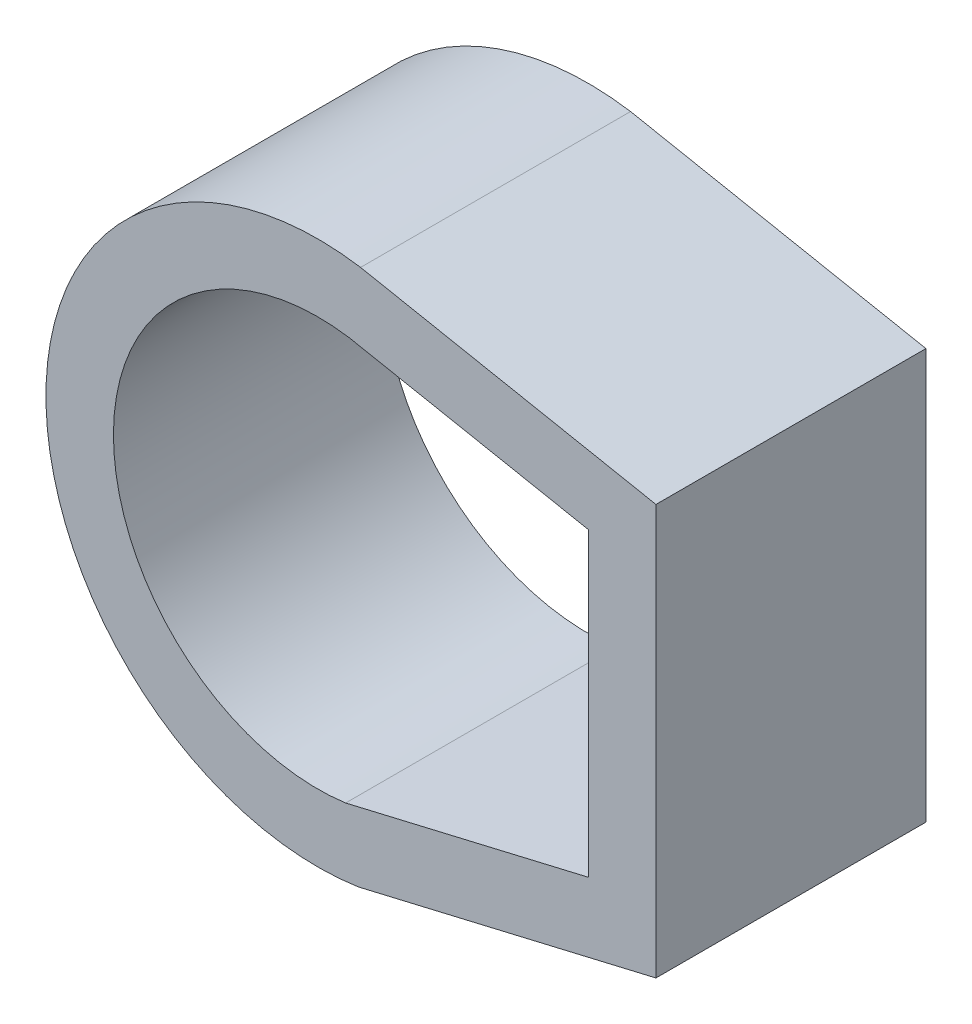
ISO-10303-21;
HEADER;
FILE_DESCRIPTION(('STEP AP214'),'2;1');
FILE_NAME('part.step','',(''),(''),'','','');
FILE_SCHEMA(('AUTOMOTIVE_DESIGN { 1 0 10303 214 1 1 1 1 }'));
ENDSEC;
DATA;
#1=APPLICATION_CONTEXT('core data for automotive mechanical design processes');
#2=APPLICATION_PROTOCOL_DEFINITION('international standard','automotive_design',2000,#1);
#3=PRODUCT_CONTEXT('',#1,'mechanical');
#4=PRODUCT('Part','Part','',(#3));
#5=PRODUCT_RELATED_PRODUCT_CATEGORY('part','',(#4));
#6=PRODUCT_DEFINITION_FORMATION('','',#4);
#7=PRODUCT_DEFINITION_CONTEXT('part definition',#1,'design');
#8=PRODUCT_DEFINITION('design','',#6,#7);
#9=PRODUCT_DEFINITION_SHAPE('','',#8);
#10=(LENGTH_UNIT() NAMED_UNIT(*) SI_UNIT(.MILLI.,.METRE.));
#11=(NAMED_UNIT(*) PLANE_ANGLE_UNIT() SI_UNIT($,.RADIAN.));
#12=(NAMED_UNIT(*) SI_UNIT($,.STERADIAN.) SOLID_ANGLE_UNIT());
#13=UNCERTAINTY_MEASURE_WITH_UNIT(LENGTH_MEASURE(1.E-05),#10,'distance_accuracy_value','');
#14=(GEOMETRIC_REPRESENTATION_CONTEXT(3) GLOBAL_UNCERTAINTY_ASSIGNED_CONTEXT((#13)) GLOBAL_UNIT_ASSIGNED_CONTEXT((#10,
#11,#12)) REPRESENTATION_CONTEXT('',''));
#15=CARTESIAN_POINT('',(0.,0.,0.));
#16=DIRECTION('',(0.,0.,1.));
#17=DIRECTION('',(1.,0.,0.));
#18=AXIS2_PLACEMENT_3D('',#15,#16,#17);
#19=CARTESIAN_POINT('',(-29.1957078004872,-9.51907763082023,20.));
#20=DIRECTION('',(0.,0.,-1.));
#21=DIRECTION('',(-1.,0.,0.));
#22=AXIS2_PLACEMENT_3D('',#19,#20,#21);
#23=PLANE('',#22);
#24=CARTESIAN_POINT('',(-29.1957078004872,-9.51907763082023,20.));
#25=DIRECTION('',(0.,0.,1.));
#26=DIRECTION('',(-1.,0.,0.));
#27=AXIS2_PLACEMENT_3D('',#24,#25,#26);
#28=CIRCLE('',#27,20.1500000000001);
#29=CARTESIAN_POINT('',(-26.0388696983067,10.3821000528403,20.));
#30=VERTEX_POINT('',#29);
#31=CARTESIAN_POINT('',(-26.215773458125,-29.4475118722555,20.));
#32=VERTEX_POINT('',#31);
#33=EDGE_CURVE('E153',#30,#32,#28,.T.);
#34=ORIENTED_EDGE('',*,*,#33,.T.);
#35=DIRECTION('',(0.973483979447677,0.228755200506381,0.));
#36=VECTOR('',#35,1.);
#37=CARTESIAN_POINT('',(-4.15724724872229,-24.2640648998974,20.));
#38=LINE('',#37,#36);
#39=CARTESIAN_POINT('',(-4.15724724872229,-24.2640648998974,20.));
#40=VERTEX_POINT('',#39);
#41=EDGE_CURVE('E157',#32,#40,#38,.T.);
#42=ORIENTED_EDGE('',*,*,#41,.T.);
#43=DIRECTION('',(-1.23220747300578E-13,1.,0.));
#44=VECTOR('',#43,1.);
#45=CARTESIAN_POINT('',(-4.15724724872603,6.11664081053112,20.));
#46=LINE('',#45,#44);
#47=CARTESIAN_POINT('',(-4.15724724872603,6.11664081053112,20.));
#48=VERTEX_POINT('',#47);
#49=EDGE_CURVE('E161',#40,#48,#46,.T.);
#50=ORIENTED_EDGE('',*,*,#49,.T.);
#51=DIRECTION('',(-0.981525360695719,0.191332083851972,0.));
#52=VECTOR('',#51,1.);
#53=CARTESIAN_POINT('',(-4.15724724872603,6.11664081053112,20.));
#54=LINE('',#53,#52);
#55=EDGE_CURVE('E164',#48,#30,#54,.T.);
#56=ORIENTED_EDGE('',*,*,#55,.T.);
#57=EDGE_LOOP('',(#34,#42,#50,#56));
#58=FACE_BOUND('',#57,.T.);
#59=CARTESIAN_POINT('',(-29.1957078004872,-9.51907763082023,20.));
#60=DIRECTION('',(0.,0.,1.));
#61=DIRECTION('',(-1.,0.,0.));
#62=AXIS2_PLACEMENT_3D('',#59,#60,#61);
#63=CIRCLE('',#62,15.1500000000001);
#64=CARTESIAN_POINT('',(-26.9029850691205,5.45643312765069,20.));
#65=VERTEX_POINT('',#64);
#66=CARTESIAN_POINT('',(-27.1446745732339,-24.5295993639481,20.));
#67=VERTEX_POINT('',#66);
#68=EDGE_CURVE('E105',#65,#67,#63,.T.);
#69=ORIENTED_EDGE('',*,*,#68,.F.);
#70=DIRECTION('',(-0.981525360695719,0.191332083851972,0.));
#71=VECTOR('',#70,1.);
#72=CARTESIAN_POINT('',(-9.15724724872553,1.99719597227013,20.));
#73=LINE('',#72,#71);
#74=CARTESIAN_POINT('',(-9.15724724872552,1.99719597227014,20.));
#75=VERTEX_POINT('',#74);
#76=EDGE_CURVE('E131',#75,#65,#73,.T.);
#77=ORIENTED_EDGE('',*,*,#76,.F.);
#78=DIRECTION('',(-1.23219819997635E-13,1.,0.));
#79=VECTOR('',#78,1.);
#80=CARTESIAN_POINT('',(-9.15724724872553,1.99719597227013,20.));
#81=LINE('',#80,#79);
#82=CARTESIAN_POINT('',(-9.15724724872278,-20.3028040277299,20.));
#83=VERTEX_POINT('',#82);
#84=EDGE_CURVE('E127',#83,#75,#81,.T.);
#85=ORIENTED_EDGE('',*,*,#84,.F.);
#86=DIRECTION('',(0.973483979447677,0.228755200506383,0.));
#87=VECTOR('',#86,1.);
#88=CARTESIAN_POINT('',(-9.15724724872278,-20.3028040277299,20.));
#89=LINE('',#88,#87);
#90=EDGE_CURVE('E114',#67,#83,#89,.T.);
#91=ORIENTED_EDGE('',*,*,#90,.F.);
#92=EDGE_LOOP('',(#69,#77,#85,#91));
#93=FACE_BOUND('',#92,.T.);
#94=ADVANCED_FACE('F39',(#58,#93),#23,.F.);
#95=CARTESIAN_POINT('',(-29.1957078004872,-9.51907763082023,0.));
#96=DIRECTION('',(0.,0.,-1.));
#97=DIRECTION('',(-1.,0.,0.));
#98=AXIS2_PLACEMENT_3D('',#95,#96,#97);
#99=PLANE('',#98);
#100=CARTESIAN_POINT('',(-29.1957078004872,-9.51907763082023,0.));
#101=DIRECTION('',(0.,0.,1.));
#102=DIRECTION('',(-1.,0.,0.));
#103=AXIS2_PLACEMENT_3D('',#100,#101,#102);
#104=CIRCLE('',#103,20.1500000000001);
#105=CARTESIAN_POINT('',(-26.0388696983067,10.3821000528403,0.));
#106=VERTEX_POINT('',#105);
#107=CARTESIAN_POINT('',(-26.215773458125,-29.4475118722555,0.));
#108=VERTEX_POINT('',#107);
#109=EDGE_CURVE('E123',#106,#108,#104,.T.);
#110=ORIENTED_EDGE('',*,*,#109,.F.);
#111=DIRECTION('',(-0.981525360695719,0.191332083851972,0.));
#112=VECTOR('',#111,1.);
#113=CARTESIAN_POINT('',(-4.15724724872603,6.11664081053112,0.));
#114=LINE('',#113,#112);
#115=CARTESIAN_POINT('',(-4.15724724872603,6.11664081053112,0.));
#116=VERTEX_POINT('',#115);
#117=EDGE_CURVE('E158',#116,#106,#114,.T.);
#118=ORIENTED_EDGE('',*,*,#117,.F.);
#119=DIRECTION('',(-1.23220747300578E-13,1.,0.));
#120=VECTOR('',#119,1.);
#121=CARTESIAN_POINT('',(-4.15724724872603,6.11664081053112,0.));
#122=LINE('',#121,#120);
#123=CARTESIAN_POINT('',(-4.15724724872229,-24.2640648998974,0.));
#124=VERTEX_POINT('',#123);
#125=EDGE_CURVE('E174',#124,#116,#122,.T.);
#126=ORIENTED_EDGE('',*,*,#125,.F.);
#127=DIRECTION('',(0.973483979447677,0.228755200506381,0.));
#128=VECTOR('',#127,1.);
#129=CARTESIAN_POINT('',(-4.15724724872229,-24.2640648998974,0.));
#130=LINE('',#129,#128);
#131=EDGE_CURVE('E171',#108,#124,#130,.T.);
#132=ORIENTED_EDGE('',*,*,#131,.F.);
#133=EDGE_LOOP('',(#110,#118,#126,#132));
#134=FACE_BOUND('',#133,.T.);
#135=DIRECTION('',(-0.981525360695719,0.191332083851972,0.));
#136=VECTOR('',#135,1.);
#137=CARTESIAN_POINT('',(-9.15724724872553,1.99719597227013,0.));
#138=LINE('',#137,#136);
#139=CARTESIAN_POINT('',(-9.15724724872553,1.99719597227013,0.));
#140=VERTEX_POINT('',#139);
#141=CARTESIAN_POINT('',(-26.9029850691205,5.45643312765069,0.));
#142=VERTEX_POINT('',#141);
#143=EDGE_CURVE('E115',#140,#142,#138,.T.);
#144=ORIENTED_EDGE('',*,*,#143,.T.);
#145=CARTESIAN_POINT('',(-29.1957078004872,-9.51907763082023,0.));
#146=DIRECTION('',(0.,0.,1.));
#147=DIRECTION('',(-1.,0.,0.));
#148=AXIS2_PLACEMENT_3D('',#145,#146,#147);
#149=CIRCLE('',#148,15.1500000000001);
#150=CARTESIAN_POINT('',(-27.1446745732339,-24.5295993639481,0.));
#151=VERTEX_POINT('',#150);
#152=EDGE_CURVE('E63',#142,#151,#149,.T.);
#153=ORIENTED_EDGE('',*,*,#152,.T.);
#154=DIRECTION('',(0.973483979447677,0.228755200506383,0.));
#155=VECTOR('',#154,1.);
#156=CARTESIAN_POINT('',(-9.15724724872278,-20.3028040277299,0.));
#157=LINE('',#156,#155);
#158=CARTESIAN_POINT('',(-9.15724724872278,-20.3028040277299,0.));
#159=VERTEX_POINT('',#158);
#160=EDGE_CURVE('E121',#151,#159,#157,.T.);
#161=ORIENTED_EDGE('',*,*,#160,.T.);
#162=DIRECTION('',(-1.23219819997635E-13,1.,0.));
#163=VECTOR('',#162,1.);
#164=CARTESIAN_POINT('',(-9.15724724872553,1.99719597227013,0.));
#165=LINE('',#164,#163);
#166=EDGE_CURVE('E140',#159,#140,#165,.T.);
#167=ORIENTED_EDGE('',*,*,#166,.T.);
#168=EDGE_LOOP('',(#144,#153,#161,#167));
#169=FACE_BOUND('',#168,.T.);
#170=ADVANCED_FACE('F197',(#134,#169),#99,.T.);
#171=CARTESIAN_POINT('',(-29.1957078004872,-9.51907763082023,20.));
#172=DIRECTION('',(0.,0.,-1.));
#173=DIRECTION('',(-1.,0.,0.));
#174=AXIS2_PLACEMENT_3D('',#171,#172,#173);
#175=CYLINDRICAL_SURFACE('',#174,20.1500000000001);
#176=ORIENTED_EDGE('',*,*,#109,.T.);
#177=DIRECTION('',(0.,0.,-1.));
#178=VECTOR('',#177,1.);
#179=CARTESIAN_POINT('',(-26.215773458125,-29.4475118722555,20.));
#180=LINE('',#179,#178);
#181=EDGE_CURVE('E11',#32,#108,#180,.T.);
#182=ORIENTED_EDGE('',*,*,#181,.F.);
#183=ORIENTED_EDGE('',*,*,#33,.F.);
#184=DIRECTION('',(0.,0.,-1.));
#185=VECTOR('',#184,1.);
#186=CARTESIAN_POINT('',(-26.0388696983067,10.3821000528403,20.));
#187=LINE('',#186,#185);
#188=EDGE_CURVE('E167',#30,#106,#187,.T.);
#189=ORIENTED_EDGE('',*,*,#188,.T.);
#190=EDGE_LOOP('',(#176,#182,#183,#189));
#191=FACE_BOUND('',#190,.T.);
#192=ADVANCED_FACE('F41',(#191),#175,.T.);
#193=CARTESIAN_POINT('',(-4.15724724872229,-24.2640648998974,20.));
#194=DIRECTION('',(-0.228755200506381,0.973483979447677,0.));
#195=DIRECTION('',(-0.973483979447677,-0.228755200506381,0.));
#196=AXIS2_PLACEMENT_3D('',#193,#194,#195);
#197=PLANE('',#196);
#198=ORIENTED_EDGE('',*,*,#131,.T.);
#199=DIRECTION('',(0.,0.,-1.));
#200=VECTOR('',#199,1.);
#201=CARTESIAN_POINT('',(-4.15724724872229,-24.2640648998974,20.));
#202=LINE('',#201,#200);
#203=EDGE_CURVE('E48',#40,#124,#202,.T.);
#204=ORIENTED_EDGE('',*,*,#203,.F.);
#205=ORIENTED_EDGE('',*,*,#41,.F.);
#206=ORIENTED_EDGE('',*,*,#181,.T.);
#207=EDGE_LOOP('',(#198,#204,#205,#206));
#208=FACE_BOUND('',#207,.T.);
#209=ADVANCED_FACE('F207',(#208),#197,.F.);
#210=CARTESIAN_POINT('',(-4.15724724872603,6.11664081053112,20.));
#211=DIRECTION('',(-1.,-1.23220747300578E-13,0.));
#212=DIRECTION('',(1.23220747300578E-13,-1.,0.));
#213=AXIS2_PLACEMENT_3D('',#210,#211,#212);
#214=PLANE('',#213);
#215=ORIENTED_EDGE('',*,*,#125,.T.);
#216=DIRECTION('',(0.,0.,-1.));
#217=VECTOR('',#216,1.);
#218=CARTESIAN_POINT('',(-4.15724724872603,6.11664081053112,20.));
#219=LINE('',#218,#217);
#220=EDGE_CURVE('E182',#48,#116,#219,.T.);
#221=ORIENTED_EDGE('',*,*,#220,.F.);
#222=ORIENTED_EDGE('',*,*,#49,.F.);
#223=ORIENTED_EDGE('',*,*,#203,.T.);
#224=EDGE_LOOP('',(#215,#221,#222,#223));
#225=FACE_BOUND('',#224,.T.);
#226=ADVANCED_FACE('F191',(#225),#214,.F.);
#227=CARTESIAN_POINT('',(-4.15724724872603,6.11664081053112,20.));
#228=DIRECTION('',(-0.191332083851972,-0.981525360695719,0.));
#229=DIRECTION('',(0.981525360695719,-0.191332083851972,0.));
#230=AXIS2_PLACEMENT_3D('',#227,#228,#229);
#231=PLANE('',#230);
#232=ORIENTED_EDGE('',*,*,#117,.T.);
#233=ORIENTED_EDGE('',*,*,#188,.F.);
#234=ORIENTED_EDGE('',*,*,#55,.F.);
#235=ORIENTED_EDGE('',*,*,#220,.T.);
#236=EDGE_LOOP('',(#232,#233,#234,#235));
#237=FACE_BOUND('',#236,.T.);
#238=ADVANCED_FACE('F201',(#237),#231,.F.);
#239=CARTESIAN_POINT('',(-29.1957078004872,-9.51907763082023,20.));
#240=DIRECTION('',(0.,0.,-1.));
#241=DIRECTION('',(-1.,0.,0.));
#242=AXIS2_PLACEMENT_3D('',#239,#240,#241);
#243=CYLINDRICAL_SURFACE('',#242,15.1500000000001);
#244=ORIENTED_EDGE('',*,*,#152,.F.);
#245=DIRECTION('',(0.,0.,-1.));
#246=VECTOR('',#245,1.);
#247=CARTESIAN_POINT('',(-26.9029850691205,5.45643312765069,20.));
#248=LINE('',#247,#246);
#249=EDGE_CURVE('E109',#65,#142,#248,.T.);
#250=ORIENTED_EDGE('',*,*,#249,.F.);
#251=ORIENTED_EDGE('',*,*,#68,.T.);
#252=DIRECTION('',(0.,0.,-1.));
#253=VECTOR('',#252,1.);
#254=CARTESIAN_POINT('',(-27.1446745732339,-24.5295993639481,20.));
#255=LINE('',#254,#253);
#256=EDGE_CURVE('E108',#67,#151,#255,.T.);
#257=ORIENTED_EDGE('',*,*,#256,.T.);
#258=EDGE_LOOP('',(#244,#250,#251,#257));
#259=FACE_BOUND('',#258,.T.);
#260=ADVANCED_FACE('F107',(#259),#243,.F.);
#261=CARTESIAN_POINT('',(-9.15724724872278,-20.3028040277299,20.));
#262=DIRECTION('',(-0.228755200506383,0.973483979447677,0.));
#263=DIRECTION('',(-0.973483979447677,-0.228755200506383,0.));
#264=AXIS2_PLACEMENT_3D('',#261,#262,#263);
#265=PLANE('',#264);
#266=ORIENTED_EDGE('',*,*,#160,.F.);
#267=ORIENTED_EDGE('',*,*,#256,.F.);
#268=ORIENTED_EDGE('',*,*,#90,.T.);
#269=DIRECTION('',(0.,0.,-1.));
#270=VECTOR('',#269,1.);
#271=CARTESIAN_POINT('',(-9.15724724872278,-20.3028040277299,20.));
#272=LINE('',#271,#270);
#273=EDGE_CURVE('E124',#83,#159,#272,.T.);
#274=ORIENTED_EDGE('',*,*,#273,.T.);
#275=EDGE_LOOP('',(#266,#267,#268,#274));
#276=FACE_BOUND('',#275,.T.);
#277=ADVANCED_FACE('F118',(#276),#265,.T.);
#278=CARTESIAN_POINT('',(-9.15724724872553,1.99719597227013,20.));
#279=DIRECTION('',(-1.,-1.23219819997635E-13,0.));
#280=DIRECTION('',(1.23219819997635E-13,-1.,0.));
#281=AXIS2_PLACEMENT_3D('',#278,#279,#280);
#282=PLANE('',#281);
#283=ORIENTED_EDGE('',*,*,#166,.F.);
#284=ORIENTED_EDGE('',*,*,#273,.F.);
#285=ORIENTED_EDGE('',*,*,#84,.T.);
#286=DIRECTION('',(0.,0.,-1.));
#287=VECTOR('',#286,1.);
#288=CARTESIAN_POINT('',(-9.15724724872553,1.99719597227013,20.));
#289=LINE('',#288,#287);
#290=EDGE_CURVE('E55',#75,#140,#289,.T.);
#291=ORIENTED_EDGE('',*,*,#290,.T.);
#292=EDGE_LOOP('',(#283,#284,#285,#291));
#293=FACE_BOUND('',#292,.T.);
#294=ADVANCED_FACE('F230',(#293),#282,.T.);
#295=CARTESIAN_POINT('',(-9.15724724872553,1.99719597227013,20.));
#296=DIRECTION('',(-0.191332083851972,-0.981525360695719,0.));
#297=DIRECTION('',(0.981525360695719,-0.191332083851972,0.));
#298=AXIS2_PLACEMENT_3D('',#295,#296,#297);
#299=PLANE('',#298);
#300=ORIENTED_EDGE('',*,*,#143,.F.);
#301=ORIENTED_EDGE('',*,*,#290,.F.);
#302=ORIENTED_EDGE('',*,*,#76,.T.);
#303=ORIENTED_EDGE('',*,*,#249,.T.);
#304=EDGE_LOOP('',(#300,#301,#302,#303));
#305=FACE_BOUND('',#304,.T.);
#306=ADVANCED_FACE('F234',(#305),#299,.T.);
#307=CLOSED_SHELL('',(#94,#170,#192,#209,#226,#238,#260,#277,#294,#306));
#308=MANIFOLD_SOLID_BREP('B2',#307);
#309=ADVANCED_BREP_SHAPE_REPRESENTATION('',(#18,#308),#14);
#310=SHAPE_DEFINITION_REPRESENTATION(#9,#309);
ENDSEC;
END-ISO-10303-21;
